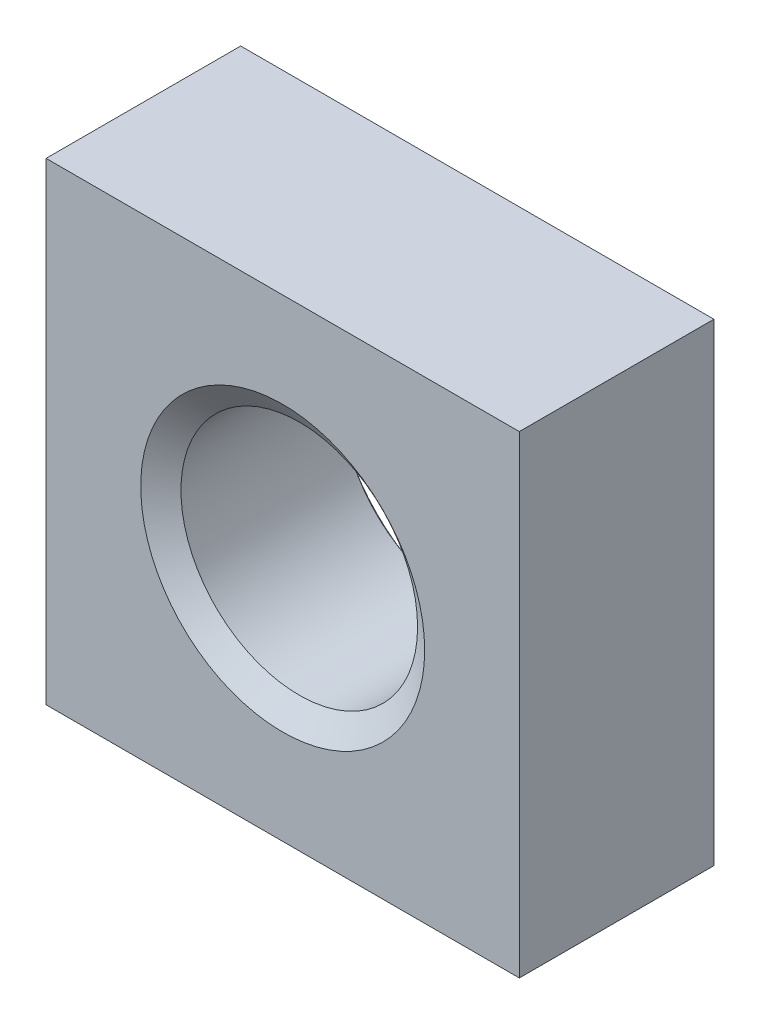
ISO-10303-21;
HEADER;
FILE_DESCRIPTION(('STEP AP214'),'2;1');
FILE_NAME('part.step','',(''),(''),'','','');
FILE_SCHEMA(('AUTOMOTIVE_DESIGN { 1 0 10303 214 1 1 1 1 }'));
ENDSEC;
DATA;
#1=APPLICATION_CONTEXT('core data for automotive mechanical design processes');
#2=APPLICATION_PROTOCOL_DEFINITION('international standard','automotive_design',2000,#1);
#3=PRODUCT_CONTEXT('',#1,'mechanical');
#4=PRODUCT('Part','Part','',(#3));
#5=PRODUCT_RELATED_PRODUCT_CATEGORY('part','',(#4));
#6=PRODUCT_DEFINITION_FORMATION('','',#4);
#7=PRODUCT_DEFINITION_CONTEXT('part definition',#1,'design');
#8=PRODUCT_DEFINITION('design','',#6,#7);
#9=PRODUCT_DEFINITION_SHAPE('','',#8);
#10=(LENGTH_UNIT() NAMED_UNIT(*) SI_UNIT(.MILLI.,.METRE.));
#11=(NAMED_UNIT(*) PLANE_ANGLE_UNIT() SI_UNIT($,.RADIAN.));
#12=(NAMED_UNIT(*) SI_UNIT($,.STERADIAN.) SOLID_ANGLE_UNIT());
#13=UNCERTAINTY_MEASURE_WITH_UNIT(LENGTH_MEASURE(1.E-05),#10,'distance_accuracy_value','');
#14=(GEOMETRIC_REPRESENTATION_CONTEXT(3) GLOBAL_UNCERTAINTY_ASSIGNED_CONTEXT((#13)) GLOBAL_UNIT_ASSIGNED_CONTEXT((#10,
#11,#12)) REPRESENTATION_CONTEXT('',''));
#15=CARTESIAN_POINT('',(0.,0.,0.));
#16=DIRECTION('',(0.,0.,1.));
#17=DIRECTION('',(1.,0.,0.));
#18=AXIS2_PLACEMENT_3D('',#15,#16,#17);
#19=CARTESIAN_POINT('',(0.,0.,-6.5278));
#20=DIRECTION('',(0.,0.,1.));
#21=DIRECTION('',(1.,0.,0.));
#22=AXIS2_PLACEMENT_3D('',#19,#20,#21);
#23=CYLINDRICAL_SURFACE('',#22,3.96875);
#24=CARTESIAN_POINT('',(0.,0.,-0.555789733453956));
#25=DIRECTION('',(0.,0.,1.));
#26=DIRECTION('',(1.,0.,0.));
#27=AXIS2_PLACEMENT_3D('',#24,#25,#26);
#28=CIRCLE('',#27,3.96875);
#29=CARTESIAN_POINT('',(3.96875,0.,-0.555789733453956));
#30=VERTEX_POINT('',#29);
#31=EDGE_CURVE('E104',#30,#30,#28,.F.);
#32=CARTESIAN_POINT('',(0.,0.,-5.94661026654604));
#33=DIRECTION('',(0.,0.,-1.));
#34=DIRECTION('',(-1.,0.,0.));
#35=AXIS2_PLACEMENT_3D('',#32,#33,#34);
#36=CIRCLE('',#35,3.96875);
#37=CARTESIAN_POINT('',(3.96875,0.,-5.94661026654604));
#38=VERTEX_POINT('',#37);
#39=EDGE_CURVE('E36',#38,#38,#36,.F.);
#40=CARTESIAN_POINT('',(3.96875,0.,-0.555789733453956));
#41=CARTESIAN_POINT('',(3.96875,0.,-0.611944114006998));
#42=CARTESIAN_POINT('',(3.96875,0.,-0.668098494560041));
#43=CARTESIAN_POINT('',(3.96875,0.,-0.780407255666126));
#44=CARTESIAN_POINT('',(3.96875,0.,-0.836561636219169));
#45=CARTESIAN_POINT('',(3.96875,0.,-0.948870397325254));
#46=CARTESIAN_POINT('',(3.96875,0.,-1.0050247778783));
#47=CARTESIAN_POINT('',(3.96875,0.,-1.11733353898438));
#48=CARTESIAN_POINT('',(3.96875,0.,-1.17348791953742));
#49=CARTESIAN_POINT('',(3.96875,0.,-1.28579668064351));
#50=CARTESIAN_POINT('',(3.96875,0.,-1.34195106119655));
#51=CARTESIAN_POINT('',(3.96875,0.,-1.45425982230264));
#52=CARTESIAN_POINT('',(3.96875,0.,-1.51041420285568));
#53=CARTESIAN_POINT('',(3.96875,0.,-1.62272296396176));
#54=CARTESIAN_POINT('',(3.96875,0.,-1.67887734451481));
#55=CARTESIAN_POINT('',(3.96875,0.,-1.79118610562089));
#56=CARTESIAN_POINT('',(3.96875,0.,-1.84734048617393));
#57=CARTESIAN_POINT('',(3.96875,0.,-1.95964924728002));
#58=CARTESIAN_POINT('',(3.96875,0.,-2.01580362783306));
#59=CARTESIAN_POINT('',(3.96875,0.,-2.12811238893915));
#60=CARTESIAN_POINT('',(3.96875,0.,-2.18426676949219));
#61=CARTESIAN_POINT('',(3.96875,0.,-2.29657553059828));
#62=CARTESIAN_POINT('',(3.96875,0.,-2.35272991115132));
#63=CARTESIAN_POINT('',(3.96875,0.,-2.4650386722574));
#64=CARTESIAN_POINT('',(3.96875,0.,-2.52119305281045));
#65=CARTESIAN_POINT('',(3.96875,0.,-2.63350181391653));
#66=CARTESIAN_POINT('',(3.96875,0.,-2.68965619446957));
#67=CARTESIAN_POINT('',(3.96875,0.,-2.80196495557566));
#68=CARTESIAN_POINT('',(3.96875,0.,-2.8581193361287));
#69=CARTESIAN_POINT('',(3.96875,0.,-2.97042809723479));
#70=CARTESIAN_POINT('',(3.96875,0.,-3.02658247778783));
#71=CARTESIAN_POINT('',(3.96875,0.,-3.13889123889391));
#72=CARTESIAN_POINT('',(3.96875,0.,-3.19504561944696));
#73=CARTESIAN_POINT('',(3.96875,0.,-3.30735438055304));
#74=CARTESIAN_POINT('',(3.96875,0.,-3.36350876110608));
#75=CARTESIAN_POINT('',(3.96875,0.,-3.47581752221217));
#76=CARTESIAN_POINT('',(3.96875,0.,-3.53197190276521));
#77=CARTESIAN_POINT('',(3.96875,0.,-3.6442806638713));
#78=CARTESIAN_POINT('',(3.96875,0.,-3.70043504442434));
#79=CARTESIAN_POINT('',(3.96875,0.,-3.81274380553042));
#80=CARTESIAN_POINT('',(3.96875,0.,-3.86889818608347));
#81=CARTESIAN_POINT('',(3.96875,0.,-3.98120694718955));
#82=CARTESIAN_POINT('',(3.96875,0.,-4.03736132774259));
#83=CARTESIAN_POINT('',(3.96875,0.,-4.14967008884868));
#84=CARTESIAN_POINT('',(3.96875,0.,-4.20582446940172));
#85=CARTESIAN_POINT('',(3.96875,0.,-4.31813323050781));
#86=CARTESIAN_POINT('',(3.96875,0.,-4.37428761106085));
#87=CARTESIAN_POINT('',(3.96875,0.,-4.48659637216693));
#88=CARTESIAN_POINT('',(3.96875,0.,-4.54275075271998));
#89=CARTESIAN_POINT('',(3.96875,0.,-4.65505951382606));
#90=CARTESIAN_POINT('',(3.96875,0.,-4.7112138943791));
#91=CARTESIAN_POINT('',(3.96875,0.,-4.82352265548519));
#92=CARTESIAN_POINT('',(3.96875,0.,-4.87967703603823));
#93=CARTESIAN_POINT('',(3.96875,0.,-4.99198579714432));
#94=CARTESIAN_POINT('',(3.96875,0.,-5.04814017769736));
#95=CARTESIAN_POINT('',(3.96875,0.,-5.16044893880344));
#96=CARTESIAN_POINT('',(3.96875,0.,-5.21660331935649));
#97=CARTESIAN_POINT('',(3.96875,0.,-5.32891208046257));
#98=CARTESIAN_POINT('',(3.96875,0.,-5.38506646101562));
#99=CARTESIAN_POINT('',(3.96875,0.,-5.4973752221217));
#100=CARTESIAN_POINT('',(3.96875,0.,-5.55352960267474));
#101=CARTESIAN_POINT('',(3.96875,0.,-5.66583836378083));
#102=CARTESIAN_POINT('',(3.96875,0.,-5.72199274433387));
#103=CARTESIAN_POINT('',(3.96875,0.,-5.83430150543996));
#104=CARTESIAN_POINT('',(3.96875,0.,-5.890455885993));
#105=CARTESIAN_POINT('',(3.96875,0.,-5.94661026654604));
#106=B_SPLINE_CURVE_WITH_KNOTS('',3,(#40,#41,#42,#43,#44,#45,#46,#47,#48,#49,#50,#51,#52,#53,
#54,#55,#56,#57,#58,#59,#60,#61,#62,#63,#64,#65,#66,#67,#68,#69,#70,#71,#72,#73,#74,#75,#76,#77,
#78,#79,#80,#81,#82,#83,#84,#85,#86,#87,#88,#89,#90,#91,#92,#93,#94,#95,#96,#97,#98,#99,#100,
#101,#102,#103,#104,#105),.UNSPECIFIED.,.F.,.F.,(4,2,2,2,2,2,2,2,2,2,2,2,2,2,2,2,2,2,2,2,2,2,2,
2,2,2,2,2,2,2,2,2,4),(0.,0.168463141659128,0.336926283318256,0.505389424977383,
0.673852566636511,0.842315708295639,1.01077884995477,1.17924199161389,1.34770513327302,
1.51616827493215,1.68463141659128,1.8530945582504,2.02155769990953,2.19002084156866,
2.35848398322779,2.52694712488691,2.69541026654604,2.86387340820517,3.0323365498643,
3.20079969152343,3.36926283318255,3.53772597484168,3.70618911650081,3.87465225815994,
4.04311539981906,4.21157854147819,4.38004168313732,4.54850482479645,4.71696796645557,
4.8854311081147,5.05389424977383,5.22235739143296,5.39082053309209),.UNSPECIFIED.);
#107=EDGE_CURVE('BSEAM32',#30,#38,#106,.T.);
#108=ORIENTED_EDGE('',*,*,#31,.F.);
#109=ORIENTED_EDGE('',*,*,#39,.F.);
#110=ORIENTED_EDGE('',*,*,#107,.T.);
#111=ORIENTED_EDGE('',*,*,#107,.F.);
#112=EDGE_LOOP('',(#108,#110,#109,#111));
#113=FACE_BOUND('',#112,.T.);
#114=ADVANCED_FACE('F32',(#113),#23,.F.);
#115=CARTESIAN_POINT('',(-7.9375,-7.9375,-6.5278));
#116=DIRECTION('',(-1.,0.,0.));
#117=DIRECTION('',(0.,0.,1.));
#118=AXIS2_PLACEMENT_3D('',#115,#116,#117);
#119=PLANE('',#118);
#120=DIRECTION('',(0.,-1.,0.));
#121=VECTOR('',#120,1.);
#122=CARTESIAN_POINT('',(-7.9375,-7.9375,0.));
#123=LINE('',#122,#121);
#124=CARTESIAN_POINT('',(-7.9375,7.9375,0.));
#125=VERTEX_POINT('',#124);
#126=CARTESIAN_POINT('',(-7.9375,-7.9375,0.));
#127=VERTEX_POINT('',#126);
#128=EDGE_CURVE('E100',#125,#127,#123,.T.);
#129=ORIENTED_EDGE('',*,*,#128,.F.);
#130=DIRECTION('',(0.,0.,1.));
#131=VECTOR('',#130,1.);
#132=CARTESIAN_POINT('',(-7.9375,7.9375,-6.5278));
#133=LINE('',#132,#131);
#134=CARTESIAN_POINT('',(-7.9375,7.9375,-6.5278));
#135=VERTEX_POINT('',#134);
#136=EDGE_CURVE('E11',#135,#125,#133,.T.);
#137=ORIENTED_EDGE('',*,*,#136,.F.);
#138=DIRECTION('',(0.,-1.,0.));
#139=VECTOR('',#138,1.);
#140=CARTESIAN_POINT('',(-7.9375,-7.9375,-6.5278));
#141=LINE('',#140,#139);
#142=CARTESIAN_POINT('',(-7.9375,-7.9375,-6.5278));
#143=VERTEX_POINT('',#142);
#144=EDGE_CURVE('E93',#135,#143,#141,.T.);
#145=ORIENTED_EDGE('',*,*,#144,.T.);
#146=DIRECTION('',(0.,0.,1.));
#147=VECTOR('',#146,1.);
#148=CARTESIAN_POINT('',(-7.9375,-7.9375,-6.5278));
#149=LINE('',#148,#147);
#150=EDGE_CURVE('E76',#143,#127,#149,.T.);
#151=ORIENTED_EDGE('',*,*,#150,.T.);
#152=EDGE_LOOP('',(#129,#137,#145,#151));
#153=FACE_BOUND('',#152,.T.);
#154=ADVANCED_FACE('F34',(#153),#119,.T.);
#155=CARTESIAN_POINT('',(-7.9375,7.9375,-6.5278));
#156=DIRECTION('',(0.,1.,0.));
#157=DIRECTION('',(0.,0.,1.));
#158=AXIS2_PLACEMENT_3D('',#155,#156,#157);
#159=PLANE('',#158);
#160=DIRECTION('',(-1.,0.,0.));
#161=VECTOR('',#160,1.);
#162=CARTESIAN_POINT('',(-7.9375,7.9375,0.));
#163=LINE('',#162,#161);
#164=CARTESIAN_POINT('',(7.9375,7.9375,0.));
#165=VERTEX_POINT('',#164);
#166=EDGE_CURVE('E95',#165,#125,#163,.T.);
#167=ORIENTED_EDGE('',*,*,#166,.F.);
#168=DIRECTION('',(0.,0.,1.));
#169=VECTOR('',#168,1.);
#170=CARTESIAN_POINT('',(7.9375,7.9375,-6.5278));
#171=LINE('',#170,#169);
#172=CARTESIAN_POINT('',(7.9375,7.9375,-6.5278));
#173=VERTEX_POINT('',#172);
#174=EDGE_CURVE('E42',#173,#165,#171,.T.);
#175=ORIENTED_EDGE('',*,*,#174,.F.);
#176=DIRECTION('',(-1.,0.,0.));
#177=VECTOR('',#176,1.);
#178=CARTESIAN_POINT('',(-7.9375,7.9375,-6.5278));
#179=LINE('',#178,#177);
#180=EDGE_CURVE('E90',#173,#135,#179,.T.);
#181=ORIENTED_EDGE('',*,*,#180,.T.);
#182=ORIENTED_EDGE('',*,*,#136,.T.);
#183=EDGE_LOOP('',(#167,#175,#181,#182));
#184=FACE_BOUND('',#183,.T.);
#185=ADVANCED_FACE('F133',(#184),#159,.T.);
#186=CARTESIAN_POINT('',(7.9375,-7.9375,-6.5278));
#187=DIRECTION('',(1.,0.,0.));
#188=DIRECTION('',(0.,0.,-1.));
#189=AXIS2_PLACEMENT_3D('',#186,#187,#188);
#190=PLANE('',#189);
#191=DIRECTION('',(0.,1.,0.));
#192=VECTOR('',#191,1.);
#193=CARTESIAN_POINT('',(7.9375,-7.9375,0.));
#194=LINE('',#193,#192);
#195=CARTESIAN_POINT('',(7.9375,-7.9375,0.));
#196=VERTEX_POINT('',#195);
#197=EDGE_CURVE('E84',#196,#165,#194,.T.);
#198=ORIENTED_EDGE('',*,*,#197,.F.);
#199=DIRECTION('',(0.,0.,1.));
#200=VECTOR('',#199,1.);
#201=CARTESIAN_POINT('',(7.9375,-7.9375,-6.5278));
#202=LINE('',#201,#200);
#203=CARTESIAN_POINT('',(7.9375,-7.9375,-6.5278));
#204=VERTEX_POINT('',#203);
#205=EDGE_CURVE('E79',#204,#196,#202,.T.);
#206=ORIENTED_EDGE('',*,*,#205,.F.);
#207=DIRECTION('',(0.,1.,0.));
#208=VECTOR('',#207,1.);
#209=CARTESIAN_POINT('',(7.9375,-7.9375,-6.5278));
#210=LINE('',#209,#208);
#211=EDGE_CURVE('E82',#204,#173,#210,.T.);
#212=ORIENTED_EDGE('',*,*,#211,.T.);
#213=ORIENTED_EDGE('',*,*,#174,.T.);
#214=EDGE_LOOP('',(#198,#206,#212,#213));
#215=FACE_BOUND('',#214,.T.);
#216=ADVANCED_FACE('F81',(#215),#190,.T.);
#217=CARTESIAN_POINT('',(-7.9375,-7.9375,-6.5278));
#218=DIRECTION('',(0.,-1.,0.));
#219=DIRECTION('',(0.,0.,-1.));
#220=AXIS2_PLACEMENT_3D('',#217,#218,#219);
#221=PLANE('',#220);
#222=DIRECTION('',(1.,0.,0.));
#223=VECTOR('',#222,1.);
#224=CARTESIAN_POINT('',(-7.9375,-7.9375,0.));
#225=LINE('',#224,#223);
#226=EDGE_CURVE('E103',#127,#196,#225,.T.);
#227=ORIENTED_EDGE('',*,*,#226,.F.);
#228=ORIENTED_EDGE('',*,*,#150,.F.);
#229=DIRECTION('',(1.,0.,0.));
#230=VECTOR('',#229,1.);
#231=CARTESIAN_POINT('',(-7.9375,-7.9375,-6.5278));
#232=LINE('',#231,#230);
#233=EDGE_CURVE('E89',#143,#204,#232,.T.);
#234=ORIENTED_EDGE('',*,*,#233,.T.);
#235=ORIENTED_EDGE('',*,*,#205,.T.);
#236=EDGE_LOOP('',(#227,#228,#234,#235));
#237=FACE_BOUND('',#236,.T.);
#238=ADVANCED_FACE('F92',(#237),#221,.T.);
#239=CARTESIAN_POINT('',(-7.9375,7.9375,-6.5278));
#240=DIRECTION('',(0.,0.,-1.));
#241=DIRECTION('',(-1.,0.,0.));
#242=AXIS2_PLACEMENT_3D('',#239,#240,#241);
#243=PLANE('',#242);
#244=CARTESIAN_POINT('',(0.,0.,-6.5278));
#245=DIRECTION('',(0.,0.,-1.));
#246=DIRECTION('',(-1.,0.,0.));
#247=AXIS2_PLACEMENT_3D('',#244,#245,#246);
#248=CIRCLE('',#247,4.7625);
#249=CARTESIAN_POINT('',(-4.7625,0.,-6.5278));
#250=VERTEX_POINT('',#249);
#251=EDGE_CURVE('E113',#250,#250,#248,.F.);
#252=ORIENTED_EDGE('',*,*,#251,.T.);
#253=EDGE_LOOP('',(#252));
#254=FACE_BOUND('',#253,.T.);
#255=ORIENTED_EDGE('',*,*,#144,.F.);
#256=ORIENTED_EDGE('',*,*,#180,.F.);
#257=ORIENTED_EDGE('',*,*,#211,.F.);
#258=ORIENTED_EDGE('',*,*,#233,.F.);
#259=EDGE_LOOP('',(#255,#256,#257,#258));
#260=FACE_BOUND('',#259,.T.);
#261=ADVANCED_FACE('F88',(#254,#260),#243,.T.);
#262=CARTESIAN_POINT('',(-7.9375,7.9375,0.));
#263=DIRECTION('',(0.,0.,-1.));
#264=DIRECTION('',(-1.,0.,0.));
#265=AXIS2_PLACEMENT_3D('',#262,#263,#264);
#266=PLANE('',#265);
#267=CARTESIAN_POINT('',(0.,0.,0.));
#268=DIRECTION('',(0.,0.,1.));
#269=DIRECTION('',(1.,0.,0.));
#270=AXIS2_PLACEMENT_3D('',#267,#268,#269);
#271=CIRCLE('',#270,4.7625);
#272=CARTESIAN_POINT('',(4.7625,0.,0.));
#273=VERTEX_POINT('',#272);
#274=EDGE_CURVE('E112',#273,#273,#271,.T.);
#275=ORIENTED_EDGE('',*,*,#274,.F.);
#276=EDGE_LOOP('',(#275));
#277=FACE_BOUND('',#276,.T.);
#278=ORIENTED_EDGE('',*,*,#128,.T.);
#279=ORIENTED_EDGE('',*,*,#226,.T.);
#280=ORIENTED_EDGE('',*,*,#197,.T.);
#281=ORIENTED_EDGE('',*,*,#166,.T.);
#282=EDGE_LOOP('',(#278,#279,#280,#281));
#283=FACE_BOUND('',#282,.T.);
#284=ADVANCED_FACE('F129',(#277,#283),#266,.F.);
#285=CARTESIAN_POINT('',(0.,0.,-0.611368706799353));
#286=DIRECTION('',(0.,0.,1.));
#287=DIRECTION('',(1.,0.,0.));
#288=AXIS2_PLACEMENT_3D('',#285,#286,#287);
#289=CONICAL_SURFACE('',#288,3.889375,0.959931088596879);
#290=ORIENTED_EDGE('',*,*,#274,.T.);
#291=EDGE_LOOP('',(#290));
#292=FACE_BOUND('',#291,.T.);
#293=ORIENTED_EDGE('',*,*,#31,.T.);
#294=EDGE_LOOP('',(#293));
#295=FACE_BOUND('',#294,.T.);
#296=ADVANCED_FACE('F126',(#292,#295),#289,.F.);
#297=CARTESIAN_POINT('',(0.,0.,-6.5024));
#298=DIRECTION('',(0.,0.,-1.));
#299=DIRECTION('',(-1.,0.,0.));
#300=AXIS2_PLACEMENT_3D('',#297,#298,#299);
#301=CONICAL_SURFACE('',#300,4.7625,0.959931088596881);
#302=CARTESIAN_POINT('',(0.,0.,-6.5024));
#303=DIRECTION('',(0.,0.,1.));
#304=DIRECTION('',(1.,0.,0.));
#305=AXIS2_PLACEMENT_3D('',#302,#303,#304);
#306=CIRCLE('',#305,4.7625);
#307=CARTESIAN_POINT('',(4.7625,0.,-6.5024));
#308=VERTEX_POINT('',#307);
#309=EDGE_CURVE('E115',#308,#308,#306,.T.);
#310=ORIENTED_EDGE('',*,*,#309,.F.);
#311=EDGE_LOOP('',(#310));
#312=FACE_BOUND('',#311,.T.);
#313=ORIENTED_EDGE('',*,*,#39,.T.);
#314=EDGE_LOOP('',(#313));
#315=FACE_BOUND('',#314,.T.);
#316=ADVANCED_FACE('F196',(#312,#315),#301,.F.);
#317=CARTESIAN_POINT('',(0.,0.,-25.0375057290932));
#318=DIRECTION('',(0.,0.,1.));
#319=DIRECTION('',(1.,0.,0.));
#320=AXIS2_PLACEMENT_3D('',#317,#318,#319);
#321=CYLINDRICAL_SURFACE('',#320,4.7625);
#322=ORIENTED_EDGE('',*,*,#251,.F.);
#323=EDGE_LOOP('',(#322));
#324=FACE_BOUND('',#323,.T.);
#325=ORIENTED_EDGE('',*,*,#309,.T.);
#326=EDGE_LOOP('',(#325));
#327=FACE_BOUND('',#326,.T.);
#328=ADVANCED_FACE('F203',(#324,#327),#321,.F.);
#329=CLOSED_SHELL('',(#114,#154,#185,#216,#238,#261,#284,#296,#316,#328));
#330=MANIFOLD_SOLID_BREP('B2',#329);
#331=ADVANCED_BREP_SHAPE_REPRESENTATION('',(#18,#330),#14);
#332=SHAPE_DEFINITION_REPRESENTATION(#9,#331);
ENDSEC;
END-ISO-10303-21;
